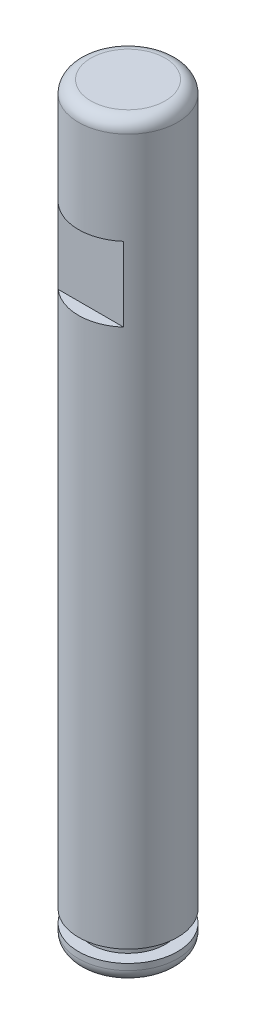
ISO-10303-21;
HEADER;
FILE_DESCRIPTION(('STEP AP214'),'2;1');
FILE_NAME('part.step','',(''),(''),'','','');
FILE_SCHEMA(('AUTOMOTIVE_DESIGN { 1 0 10303 214 1 1 1 1 }'));
ENDSEC;
DATA;
#1=APPLICATION_CONTEXT('core data for automotive mechanical design processes');
#2=APPLICATION_PROTOCOL_DEFINITION('international standard','automotive_design',2000,#1);
#3=PRODUCT_CONTEXT('',#1,'mechanical');
#4=PRODUCT('Part','Part','',(#3));
#5=PRODUCT_RELATED_PRODUCT_CATEGORY('part','',(#4));
#6=PRODUCT_DEFINITION_FORMATION('','',#4);
#7=PRODUCT_DEFINITION_CONTEXT('part definition',#1,'design');
#8=PRODUCT_DEFINITION('design','',#6,#7);
#9=PRODUCT_DEFINITION_SHAPE('','',#8);
#10=(LENGTH_UNIT() NAMED_UNIT(*) SI_UNIT(.MILLI.,.METRE.));
#11=(NAMED_UNIT(*) PLANE_ANGLE_UNIT() SI_UNIT($,.RADIAN.));
#12=(NAMED_UNIT(*) SI_UNIT($,.STERADIAN.) SOLID_ANGLE_UNIT());
#13=UNCERTAINTY_MEASURE_WITH_UNIT(LENGTH_MEASURE(1.E-05),#10,'distance_accuracy_value','');
#14=(GEOMETRIC_REPRESENTATION_CONTEXT(3) GLOBAL_UNCERTAINTY_ASSIGNED_CONTEXT((#13)) GLOBAL_UNIT_ASSIGNED_CONTEXT((#10,
#11,#12)) REPRESENTATION_CONTEXT('',''));
#15=CARTESIAN_POINT('',(0.,0.,0.));
#16=DIRECTION('',(0.,0.,1.));
#17=DIRECTION('',(1.,0.,0.));
#18=AXIS2_PLACEMENT_3D('',#15,#16,#17);
#19=CARTESIAN_POINT('',(0.,0.,0.));
#20=DIRECTION('',(0.,-1.,0.));
#21=DIRECTION('',(0.,0.,-1.));
#22=AXIS2_PLACEMENT_3D('',#19,#20,#21);
#23=CYLINDRICAL_SURFACE('',#22,2.);
#24=CARTESIAN_POINT('',(0.,29.75,0.));
#25=DIRECTION('',(0.,-1.,0.));
#26=DIRECTION('',(0.,0.,-1.));
#27=AXIS2_PLACEMENT_3D('',#24,#25,#26);
#28=CIRCLE('',#27,2.);
#29=CARTESIAN_POINT('',(0.,29.75,-2.));
#30=VERTEX_POINT('',#29);
#31=EDGE_CURVE('E89',#30,#30,#28,.T.);
#32=ORIENTED_EDGE('',*,*,#31,.T.);
#33=EDGE_LOOP('',(#32));
#34=FACE_BOUND('',#33,.T.);
#35=CARTESIAN_POINT('',(0.,1.25,0.));
#36=DIRECTION('',(0.,-1.,0.));
#37=DIRECTION('',(0.,0.,-1.));
#38=AXIS2_PLACEMENT_3D('',#35,#36,#37);
#39=CIRCLE('',#38,2.);
#40=CARTESIAN_POINT('',(0.,1.25,-2.));
#41=VERTEX_POINT('',#40);
#42=EDGE_CURVE('E77',#41,#41,#39,.T.);
#43=ORIENTED_EDGE('',*,*,#42,.F.);
#44=EDGE_LOOP('',(#43));
#45=FACE_BOUND('',#44,.T.);
#46=CARTESIAN_POINT('',(0.,23.,0.));
#47=DIRECTION('',(0.,1.,0.));
#48=DIRECTION('',(0.,0.,1.));
#49=AXIS2_PLACEMENT_3D('',#46,#47,#48);
#50=CIRCLE('',#49,2.);
#51=CARTESIAN_POINT('',(1.3228756555323,23.,1.5));
#52=VERTEX_POINT('',#51);
#53=CARTESIAN_POINT('',(-1.3228756555323,23.,1.5));
#54=VERTEX_POINT('',#53);
#55=EDGE_CURVE('E49',#52,#54,#50,.F.);
#56=ORIENTED_EDGE('',*,*,#55,.T.);
#57=DIRECTION('',(0.,-1.,0.));
#58=VECTOR('',#57,1.);
#59=CARTESIAN_POINT('',(-1.3228756555323,0.,1.5));
#60=LINE('',#59,#58);
#61=CARTESIAN_POINT('',(-1.3228756555323,26.,1.5));
#62=VERTEX_POINT('',#61);
#63=EDGE_CURVE('E11',#54,#62,#60,.F.);
#64=ORIENTED_EDGE('',*,*,#63,.T.);
#65=CARTESIAN_POINT('',(0.,26.,0.));
#66=DIRECTION('',(0.,-1.,0.));
#67=DIRECTION('',(0.,0.,-1.));
#68=AXIS2_PLACEMENT_3D('',#65,#66,#67);
#69=CIRCLE('',#68,2.);
#70=CARTESIAN_POINT('',(1.3228756555323,26.,1.5));
#71=VERTEX_POINT('',#70);
#72=EDGE_CURVE('E72',#62,#71,#69,.F.);
#73=ORIENTED_EDGE('',*,*,#72,.T.);
#74=DIRECTION('',(0.,-1.,0.));
#75=VECTOR('',#74,1.);
#76=CARTESIAN_POINT('',(1.3228756555323,0.,1.5));
#77=LINE('',#76,#75);
#78=EDGE_CURVE('E67',#71,#52,#77,.T.);
#79=ORIENTED_EDGE('',*,*,#78,.T.);
#80=EDGE_LOOP('',(#56,#64,#73,#79));
#81=FACE_BOUND('',#80,.T.);
#82=ADVANCED_FACE('F41',(#34,#45,#81),#23,.T.);
#83=CARTESIAN_POINT('',(0.,1.25,0.));
#84=DIRECTION('',(0.,1.,0.));
#85=DIRECTION('',(0.,0.,1.));
#86=AXIS2_PLACEMENT_3D('',#83,#84,#85);
#87=PLANE('',#86);
#88=CARTESIAN_POINT('',(0.,1.25,0.));
#89=DIRECTION('',(0.,-1.,0.));
#90=DIRECTION('',(0.,0.,-1.));
#91=AXIS2_PLACEMENT_3D('',#88,#89,#90);
#92=CIRCLE('',#91,1.5);
#93=CARTESIAN_POINT('',(0.,1.25,-1.5));
#94=VERTEX_POINT('',#93);
#95=EDGE_CURVE('E92',#94,#94,#92,.T.);
#96=ORIENTED_EDGE('',*,*,#95,.F.);
#97=EDGE_LOOP('',(#96));
#98=FACE_BOUND('',#97,.T.);
#99=ORIENTED_EDGE('',*,*,#42,.T.);
#100=EDGE_LOOP('',(#99));
#101=FACE_BOUND('',#100,.T.);
#102=ADVANCED_FACE('F105',(#98,#101),#87,.F.);
#103=CARTESIAN_POINT('',(0.,0.,0.));
#104=DIRECTION('',(0.,-1.,0.));
#105=DIRECTION('',(0.,0.,-1.));
#106=AXIS2_PLACEMENT_3D('',#103,#104,#105);
#107=CYLINDRICAL_SURFACE('',#106,1.5);
#108=CARTESIAN_POINT('',(0.,0.75,0.));
#109=DIRECTION('',(0.,-1.,0.));
#110=DIRECTION('',(0.,0.,-1.));
#111=AXIS2_PLACEMENT_3D('',#108,#109,#110);
#112=CIRCLE('',#111,1.5);
#113=CARTESIAN_POINT('',(0.,0.75,-1.5));
#114=VERTEX_POINT('',#113);
#115=EDGE_CURVE('E95',#114,#114,#112,.T.);
#116=ORIENTED_EDGE('',*,*,#115,.F.);
#117=EDGE_LOOP('',(#116));
#118=FACE_BOUND('',#117,.T.);
#119=ORIENTED_EDGE('',*,*,#95,.T.);
#120=EDGE_LOOP('',(#119));
#121=FACE_BOUND('',#120,.T.);
#122=ADVANCED_FACE('F114',(#118,#121),#107,.T.);
#123=CARTESIAN_POINT('',(0.,0.75,0.));
#124=DIRECTION('',(0.,1.,0.));
#125=DIRECTION('',(0.,0.,1.));
#126=AXIS2_PLACEMENT_3D('',#123,#124,#125);
#127=PLANE('',#126);
#128=ORIENTED_EDGE('',*,*,#115,.T.);
#129=EDGE_LOOP('',(#128));
#130=FACE_BOUND('',#129,.T.);
#131=CARTESIAN_POINT('',(0.,0.75,0.));
#132=DIRECTION('',(0.,-1.,0.));
#133=DIRECTION('',(0.,0.,-1.));
#134=AXIS2_PLACEMENT_3D('',#131,#132,#133);
#135=CIRCLE('',#134,2.);
#136=CARTESIAN_POINT('',(0.,0.75,-2.));
#137=VERTEX_POINT('',#136);
#138=EDGE_CURVE('E98',#137,#137,#135,.T.);
#139=ORIENTED_EDGE('',*,*,#138,.F.);
#140=EDGE_LOOP('',(#139));
#141=FACE_BOUND('',#140,.T.);
#142=ADVANCED_FACE('F121',(#130,#141),#127,.T.);
#143=CARTESIAN_POINT('',(0.,0.5,0.));
#144=DIRECTION('',(0.,-1.,0.));
#145=DIRECTION('',(0.,0.,-1.));
#146=AXIS2_PLACEMENT_3D('',#143,#144,#145);
#147=CIRCLE('',#146,2.);
#148=CARTESIAN_POINT('',(0.,0.5,-2.));
#149=VERTEX_POINT('',#148);
#150=EDGE_CURVE('E73',#149,#149,#147,.F.);
#151=ORIENTED_EDGE('',*,*,#150,.T.);
#152=EDGE_LOOP('',(#151));
#153=FACE_BOUND('',#152,.T.);
#154=ORIENTED_EDGE('',*,*,#138,.T.);
#155=EDGE_LOOP('',(#154));
#156=FACE_BOUND('',#155,.T.);
#157=ADVANCED_FACE('F110',(#153,#156),#23,.T.);
#158=CARTESIAN_POINT('',(0.,0.,0.));
#159=DIRECTION('',(0.,-1.,0.));
#160=DIRECTION('',(0.,0.,-1.));
#161=AXIS2_PLACEMENT_3D('',#158,#159,#160);
#162=PLANE('',#161);
#163=CARTESIAN_POINT('',(0.,0.,0.));
#164=DIRECTION('',(0.,-1.,0.));
#165=DIRECTION('',(0.,0.,-1.));
#166=AXIS2_PLACEMENT_3D('',#163,#164,#165);
#167=CIRCLE('',#166,1.5);
#168=CARTESIAN_POINT('',(0.,0.,-1.5));
#169=VERTEX_POINT('',#168);
#170=EDGE_CURVE('E83',#169,#169,#167,.T.);
#171=ORIENTED_EDGE('',*,*,#170,.T.);
#172=EDGE_LOOP('',(#171));
#173=FACE_BOUND('',#172,.T.);
#174=ADVANCED_FACE('F120',(#173),#162,.T.);
#175=CARTESIAN_POINT('',(0.,30.25,0.));
#176=DIRECTION('',(0.,-1.,0.));
#177=DIRECTION('',(0.,0.,-1.));
#178=AXIS2_PLACEMENT_3D('',#175,#176,#177);
#179=PLANE('',#178);
#180=CARTESIAN_POINT('',(0.,30.25,0.));
#181=DIRECTION('',(0.,-1.,0.));
#182=DIRECTION('',(0.,0.,-1.));
#183=AXIS2_PLACEMENT_3D('',#180,#181,#182);
#184=CIRCLE('',#183,1.5);
#185=CARTESIAN_POINT('',(0.,30.25,-1.5));
#186=VERTEX_POINT('',#185);
#187=EDGE_CURVE('E86',#186,#186,#184,.F.);
#188=ORIENTED_EDGE('',*,*,#187,.T.);
#189=EDGE_LOOP('',(#188));
#190=FACE_BOUND('',#189,.T.);
#191=ADVANCED_FACE('F127',(#190),#179,.F.);
#192=CARTESIAN_POINT('',(0.,29.75,0.));
#193=DIRECTION('',(0.,-1.,0.));
#194=DIRECTION('',(0.,0.,-1.));
#195=AXIS2_PLACEMENT_3D('',#192,#193,#194);
#196=TOROIDAL_SURFACE('',#195,1.5,0.5);
#197=ORIENTED_EDGE('',*,*,#187,.F.);
#198=EDGE_LOOP('',(#197));
#199=FACE_BOUND('',#198,.T.);
#200=ORIENTED_EDGE('',*,*,#31,.F.);
#201=EDGE_LOOP('',(#200));
#202=FACE_BOUND('',#201,.T.);
#203=ADVANCED_FACE('F140',(#199,#202),#196,.T.);
#204=CARTESIAN_POINT('',(0.,0.5,0.));
#205=DIRECTION('',(0.,-1.,0.));
#206=DIRECTION('',(0.,0.,-1.));
#207=AXIS2_PLACEMENT_3D('',#204,#205,#206);
#208=TOROIDAL_SURFACE('',#207,1.5,0.5);
#209=ORIENTED_EDGE('',*,*,#150,.F.);
#210=EDGE_LOOP('',(#209));
#211=FACE_BOUND('',#210,.T.);
#212=ORIENTED_EDGE('',*,*,#170,.F.);
#213=EDGE_LOOP('',(#212));
#214=FACE_BOUND('',#213,.T.);
#215=ADVANCED_FACE('F43',(#211,#214),#208,.T.);
#216=CARTESIAN_POINT('',(-2.,23.,2.));
#217=DIRECTION('',(0.,1.,0.));
#218=DIRECTION('',(0.,0.,1.));
#219=AXIS2_PLACEMENT_3D('',#216,#217,#218);
#220=PLANE('',#219);
#221=ORIENTED_EDGE('',*,*,#55,.F.);
#222=DIRECTION('',(1.,0.,0.));
#223=VECTOR('',#222,1.);
#224=CARTESIAN_POINT('',(-2.,23.,1.5));
#225=LINE('',#224,#223);
#226=EDGE_CURVE('E56',#54,#52,#225,.T.);
#227=ORIENTED_EDGE('',*,*,#226,.F.);
#228=EDGE_LOOP('',(#221,#227));
#229=FACE_BOUND('',#228,.T.);
#230=ADVANCED_FACE('F139',(#229),#220,.T.);
#231=CARTESIAN_POINT('',(-2.,26.,2.));
#232=DIRECTION('',(0.,-1.,0.));
#233=DIRECTION('',(0.,0.,-1.));
#234=AXIS2_PLACEMENT_3D('',#231,#232,#233);
#235=PLANE('',#234);
#236=DIRECTION('',(-1.,0.,0.));
#237=VECTOR('',#236,1.);
#238=CARTESIAN_POINT('',(-2.,26.,1.5));
#239=LINE('',#238,#237);
#240=EDGE_CURVE('E70',#71,#62,#239,.T.);
#241=ORIENTED_EDGE('',*,*,#240,.F.);
#242=ORIENTED_EDGE('',*,*,#72,.F.);
#243=EDGE_LOOP('',(#241,#242));
#244=FACE_BOUND('',#243,.T.);
#245=ADVANCED_FACE('F76',(#244),#235,.T.);
#246=CARTESIAN_POINT('',(0.,0.,1.5));
#247=DIRECTION('',(0.,0.,1.));
#248=DIRECTION('',(1.,0.,0.));
#249=AXIS2_PLACEMENT_3D('',#246,#247,#248);
#250=PLANE('',#249);
#251=ORIENTED_EDGE('',*,*,#226,.T.);
#252=ORIENTED_EDGE('',*,*,#78,.F.);
#253=ORIENTED_EDGE('',*,*,#240,.T.);
#254=ORIENTED_EDGE('',*,*,#63,.F.);
#255=EDGE_LOOP('',(#251,#252,#253,#254));
#256=FACE_BOUND('',#255,.T.);
#257=ADVANCED_FACE('F69',(#256),#250,.T.);
#258=CLOSED_SHELL('',(#82,#102,#122,#142,#157,#174,#191,#203,#215,#230,#245,#257));
#259=MANIFOLD_SOLID_BREP('B2',#258);
#260=ADVANCED_BREP_SHAPE_REPRESENTATION('',(#18,#259),#14);
#261=SHAPE_DEFINITION_REPRESENTATION(#9,#260);
ENDSEC;
END-ISO-10303-21;
